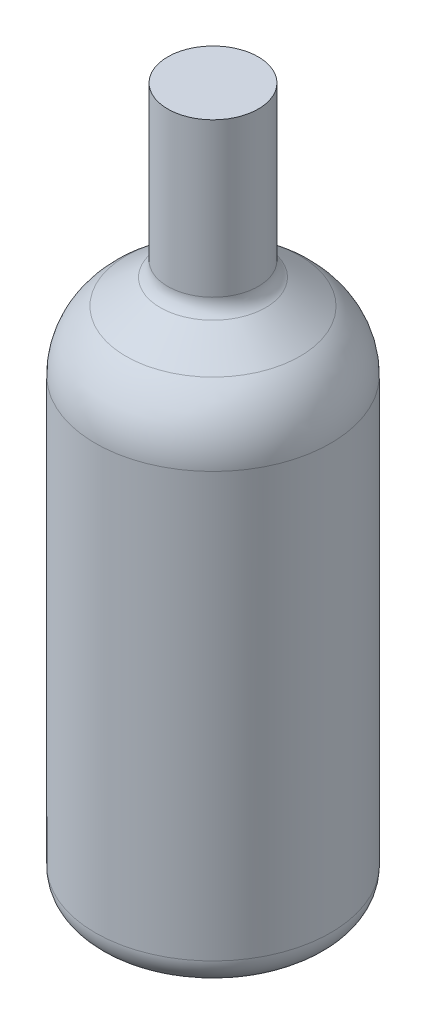
ISO-10303-21;
HEADER;
FILE_DESCRIPTION(('STEP AP214'),'2;1');
FILE_NAME('part.step','',(''),(''),'','','');
FILE_SCHEMA(('AUTOMOTIVE_DESIGN { 1 0 10303 214 1 1 1 1 }'));
ENDSEC;
DATA;
#1=APPLICATION_CONTEXT('core data for automotive mechanical design processes');
#2=APPLICATION_PROTOCOL_DEFINITION('international standard','automotive_design',2000,#1);
#3=PRODUCT_CONTEXT('',#1,'mechanical');
#4=PRODUCT('Part','Part','',(#3));
#5=PRODUCT_RELATED_PRODUCT_CATEGORY('part','',(#4));
#6=PRODUCT_DEFINITION_FORMATION('','',#4);
#7=PRODUCT_DEFINITION_CONTEXT('part definition',#1,'design');
#8=PRODUCT_DEFINITION('design','',#6,#7);
#9=PRODUCT_DEFINITION_SHAPE('','',#8);
#10=(LENGTH_UNIT() NAMED_UNIT(*) SI_UNIT(.MILLI.,.METRE.));
#11=(NAMED_UNIT(*) PLANE_ANGLE_UNIT() SI_UNIT($,.RADIAN.));
#12=(NAMED_UNIT(*) SI_UNIT($,.STERADIAN.) SOLID_ANGLE_UNIT());
#13=UNCERTAINTY_MEASURE_WITH_UNIT(LENGTH_MEASURE(1.E-05),#10,'distance_accuracy_value','');
#14=(GEOMETRIC_REPRESENTATION_CONTEXT(3) GLOBAL_UNCERTAINTY_ASSIGNED_CONTEXT((#13)) GLOBAL_UNIT_ASSIGNED_CONTEXT((#10,
#11,#12)) REPRESENTATION_CONTEXT('',''));
#15=CARTESIAN_POINT('',(0.,0.,0.));
#16=DIRECTION('',(0.,0.,1.));
#17=DIRECTION('',(1.,0.,0.));
#18=AXIS2_PLACEMENT_3D('',#15,#16,#17);
#19=CARTESIAN_POINT('',(0.,158.75,0.));
#20=DIRECTION('',(0.,-1.,0.));
#21=DIRECTION('',(0.,0.,-1.));
#22=AXIS2_PLACEMENT_3D('',#19,#20,#21);
#23=CYLINDRICAL_SURFACE('',#22,41.275);
#24=CARTESIAN_POINT('',(0.,9.99999999999998,0.));
#25=DIRECTION('',(0.,1.,0.));
#26=DIRECTION('',(0.,0.,1.));
#27=AXIS2_PLACEMENT_3D('',#24,#25,#26);
#28=CIRCLE('',#27,41.275);
#29=CARTESIAN_POINT('',(0.,9.99999999999998,-41.275));
#30=VERTEX_POINT('',#29);
#31=EDGE_CURVE('E45',#30,#30,#28,.T.);
#32=CARTESIAN_POINT('',(0.,158.75,0.));
#33=DIRECTION('',(0.,1.,0.));
#34=DIRECTION('',(0.,0.,1.));
#35=AXIS2_PLACEMENT_3D('',#32,#33,#34);
#36=CIRCLE('',#35,41.275);
#37=CARTESIAN_POINT('',(0.,158.75,-41.275));
#38=VERTEX_POINT('',#37);
#39=EDGE_CURVE('E50',#38,#38,#36,.T.);
#40=CARTESIAN_POINT('',(0.,9.99999999999998,-41.275));
#41=CARTESIAN_POINT('',(0.,11.5494791666666,-41.275));
#42=CARTESIAN_POINT('',(0.,13.0989583333333,-41.275));
#43=CARTESIAN_POINT('',(0.,16.1979166666666,-41.275));
#44=CARTESIAN_POINT('',(0.,17.7473958333333,-41.275));
#45=CARTESIAN_POINT('',(0.,20.8463541666667,-41.275));
#46=CARTESIAN_POINT('',(0.,22.3958333333333,-41.275));
#47=CARTESIAN_POINT('',(0.,25.4947916666666,-41.275));
#48=CARTESIAN_POINT('',(0.,27.0442708333333,-41.275));
#49=CARTESIAN_POINT('',(0.,30.1432291666666,-41.275));
#50=CARTESIAN_POINT('',(0.,31.6927083333333,-41.275));
#51=CARTESIAN_POINT('',(0.,34.7916666666667,-41.275));
#52=CARTESIAN_POINT('',(0.,36.3411458333333,-41.275));
#53=CARTESIAN_POINT('',(0.,39.4401041666666,-41.275));
#54=CARTESIAN_POINT('',(0.,40.9895833333333,-41.275));
#55=CARTESIAN_POINT('',(0.,44.0885416666666,-41.275));
#56=CARTESIAN_POINT('',(0.,45.6380208333333,-41.275));
#57=CARTESIAN_POINT('',(0.,48.7369791666666,-41.275));
#58=CARTESIAN_POINT('',(0.,50.2864583333333,-41.275));
#59=CARTESIAN_POINT('',(0.,53.3854166666666,-41.275));
#60=CARTESIAN_POINT('',(0.,54.9348958333333,-41.275));
#61=CARTESIAN_POINT('',(0.,58.0338541666666,-41.275));
#62=CARTESIAN_POINT('',(0.,59.5833333333333,-41.275));
#63=CARTESIAN_POINT('',(0.,62.6822916666666,-41.275));
#64=CARTESIAN_POINT('',(0.,64.2317708333333,-41.275));
#65=CARTESIAN_POINT('',(0.,67.3307291666666,-41.275));
#66=CARTESIAN_POINT('',(0.,68.8802083333333,-41.275));
#67=CARTESIAN_POINT('',(0.,71.9791666666666,-41.275));
#68=CARTESIAN_POINT('',(0.,73.5286458333333,-41.275));
#69=CARTESIAN_POINT('',(0.,76.6276041666666,-41.275));
#70=CARTESIAN_POINT('',(0.,78.1770833333333,-41.275));
#71=CARTESIAN_POINT('',(0.,81.2760416666666,-41.275));
#72=CARTESIAN_POINT('',(0.,82.8255208333333,-41.275));
#73=CARTESIAN_POINT('',(0.,85.9244791666667,-41.275));
#74=CARTESIAN_POINT('',(0.,87.4739583333333,-41.275));
#75=CARTESIAN_POINT('',(0.,90.5729166666666,-41.275));
#76=CARTESIAN_POINT('',(0.,92.1223958333333,-41.275));
#77=CARTESIAN_POINT('',(0.,95.2213541666666,-41.275));
#78=CARTESIAN_POINT('',(0.,96.7708333333333,-41.275));
#79=CARTESIAN_POINT('',(0.,99.8697916666666,-41.275));
#80=CARTESIAN_POINT('',(0.,101.419270833333,-41.275));
#81=CARTESIAN_POINT('',(0.,104.518229166667,-41.275));
#82=CARTESIAN_POINT('',(0.,106.067708333333,-41.275));
#83=CARTESIAN_POINT('',(0.,109.166666666667,-41.275));
#84=CARTESIAN_POINT('',(0.,110.716145833333,-41.275));
#85=CARTESIAN_POINT('',(0.,113.815104166667,-41.275));
#86=CARTESIAN_POINT('',(0.,115.364583333333,-41.275));
#87=CARTESIAN_POINT('',(0.,118.463541666667,-41.275));
#88=CARTESIAN_POINT('',(0.,120.013020833333,-41.275));
#89=CARTESIAN_POINT('',(0.,123.111979166667,-41.275));
#90=CARTESIAN_POINT('',(0.,124.661458333333,-41.275));
#91=CARTESIAN_POINT('',(0.,127.760416666667,-41.275));
#92=CARTESIAN_POINT('',(0.,129.309895833333,-41.275));
#93=CARTESIAN_POINT('',(0.,132.408854166667,-41.275));
#94=CARTESIAN_POINT('',(0.,133.958333333333,-41.275));
#95=CARTESIAN_POINT('',(0.,137.057291666667,-41.275));
#96=CARTESIAN_POINT('',(0.,138.606770833333,-41.275));
#97=CARTESIAN_POINT('',(0.,141.705729166667,-41.275));
#98=CARTESIAN_POINT('',(0.,143.255208333333,-41.275));
#99=CARTESIAN_POINT('',(0.,146.354166666667,-41.275));
#100=CARTESIAN_POINT('',(0.,147.903645833333,-41.275));
#101=CARTESIAN_POINT('',(0.,151.002604166667,-41.275));
#102=CARTESIAN_POINT('',(0.,152.552083333333,-41.275));
#103=CARTESIAN_POINT('',(0.,155.651041666667,-41.275));
#104=CARTESIAN_POINT('',(0.,157.200520833333,-41.275));
#105=CARTESIAN_POINT('',(0.,158.75,-41.275));
#106=B_SPLINE_CURVE_WITH_KNOTS('',3,(#40,#41,#42,#43,#44,#45,#46,#47,#48,#49,#50,#51,#52,#53,
#54,#55,#56,#57,#58,#59,#60,#61,#62,#63,#64,#65,#66,#67,#68,#69,#70,#71,#72,#73,#74,#75,#76,#77,
#78,#79,#80,#81,#82,#83,#84,#85,#86,#87,#88,#89,#90,#91,#92,#93,#94,#95,#96,#97,#98,#99,#100,
#101,#102,#103,#104,#105),.UNSPECIFIED.,.F.,.F.,(4,2,2,2,2,2,2,2,2,2,2,2,2,2,2,2,2,2,2,2,2,2,2,
2,2,2,2,2,2,2,2,2,4),(0.,4.64843749999999,9.29687500000001,13.9453125,18.59375,23.2421875,
27.890625,32.5390625,37.1875,41.8359375,46.484375,51.1328125,55.78125,60.4296875,65.078125,
69.7265625,74.375,79.0234375,83.671875,88.3203125,92.96875,97.6171875,102.265625,106.9140625,
111.5625,116.2109375,120.859375,125.5078125,130.15625,134.8046875,139.453125,144.1015625,
148.75),.UNSPECIFIED.);
#107=EDGE_CURVE('BSEAM37',#30,#38,#106,.T.);
#108=ORIENTED_EDGE('',*,*,#31,.T.);
#109=ORIENTED_EDGE('',*,*,#39,.F.);
#110=ORIENTED_EDGE('',*,*,#107,.T.);
#111=ORIENTED_EDGE('',*,*,#107,.F.);
#112=EDGE_LOOP('',(#108,#110,#109,#111));
#113=FACE_BOUND('',#112,.T.);
#114=ADVANCED_FACE('F37',(#113),#23,.T.);
#115=CARTESIAN_POINT('',(0.,0.,0.));
#116=DIRECTION('',(0.,1.,0.));
#117=DIRECTION('',(0.,0.,1.));
#118=AXIS2_PLACEMENT_3D('',#115,#116,#117);
#119=PLANE('',#118);
#120=CARTESIAN_POINT('',(0.,0.,0.));
#121=DIRECTION('',(0.,1.,0.));
#122=DIRECTION('',(0.,0.,1.));
#123=AXIS2_PLACEMENT_3D('',#120,#121,#122);
#124=CIRCLE('',#123,31.275);
#125=CARTESIAN_POINT('',(0.,0.,31.275));
#126=VERTEX_POINT('',#125);
#127=EDGE_CURVE('E10',#126,#126,#124,.F.);
#128=ORIENTED_EDGE('',*,*,#127,.T.);
#129=EDGE_LOOP('',(#128));
#130=FACE_BOUND('',#129,.T.);
#131=ADVANCED_FACE('F80',(#130),#119,.F.);
#132=CARTESIAN_POINT('',(0.,158.75,0.));
#133=DIRECTION('',(0.,1.,0.));
#134=DIRECTION('',(-1.,0.,0.));
#135=AXIS2_PLACEMENT_3D('',#132,#133,#134);
#136=DEGENERATE_TOROIDAL_SURFACE('',#135,15.2077325511096,26.0672674488904,.T.);
#137=CARTESIAN_POINT('',(0.,179.829366121803,0.));
#138=DIRECTION('',(0.,1.,0.));
#139=DIRECTION('',(-1.,0.,0.));
#140=AXIS2_PLACEMENT_3D('',#137,#138,#139);
#141=CIRCLE('',#140,30.5427498694875);
#142=CARTESIAN_POINT('',(-30.5427498694875,179.829366121803,0.));
#143=VERTEX_POINT('',#142);
#144=EDGE_CURVE('E69',#143,#143,#141,.T.);
#145=ORIENTED_EDGE('',*,*,#144,.F.);
#146=EDGE_LOOP('',(#145));
#147=FACE_BOUND('',#146,.T.);
#148=ORIENTED_EDGE('',*,*,#39,.T.);
#149=EDGE_LOOP('',(#148));
#150=FACE_BOUND('',#149,.T.);
#151=ADVANCED_FACE('F76',(#147,#150),#136,.T.);
#152=CARTESIAN_POINT('',(15.875,247.65,0.));
#153=DIRECTION('',(0.,-1.,0.));
#154=DIRECTION('',(1.,0.,0.));
#155=AXIS2_PLACEMENT_3D('',#152,#153,#154);
#156=PLANE('',#155);
#157=CARTESIAN_POINT('',(0.,247.65,0.));
#158=DIRECTION('',(0.,1.,0.));
#159=DIRECTION('',(-1.,0.,0.));
#160=AXIS2_PLACEMENT_3D('',#157,#158,#159);
#161=CIRCLE('',#160,15.875);
#162=CARTESIAN_POINT('',(-15.875,247.65,0.));
#163=VERTEX_POINT('',#162);
#164=EDGE_CURVE('E55',#163,#163,#161,.T.);
#165=ORIENTED_EDGE('',*,*,#164,.T.);
#166=EDGE_LOOP('',(#165));
#167=FACE_BOUND('',#166,.T.);
#168=ADVANCED_FACE('F79',(#167),#156,.F.);
#169=CARTESIAN_POINT('',(0.,247.65,0.));
#170=DIRECTION('',(0.,1.,0.));
#171=DIRECTION('',(-1.,0.,0.));
#172=AXIS2_PLACEMENT_3D('',#169,#170,#171);
#173=CYLINDRICAL_SURFACE('',#172,15.875);
#174=ORIENTED_EDGE('',*,*,#164,.F.);
#175=EDGE_LOOP('',(#174));
#176=FACE_BOUND('',#175,.T.);
#177=CARTESIAN_POINT('',(0.,193.733009376798,0.));
#178=DIRECTION('',(0.,1.,0.));
#179=DIRECTION('',(-1.,0.,0.));
#180=AXIS2_PLACEMENT_3D('',#177,#178,#179);
#181=CIRCLE('',#180,15.875);
#182=CARTESIAN_POINT('',(-15.875,193.733009376798,0.));
#183=VERTEX_POINT('',#182);
#184=EDGE_CURVE('E61',#183,#183,#181,.T.);
#185=ORIENTED_EDGE('',*,*,#184,.T.);
#186=EDGE_LOOP('',(#185));
#187=FACE_BOUND('',#186,.T.);
#188=ADVANCED_FACE('F92',(#176,#187),#173,.T.);
#189=CARTESIAN_POINT('',(0.,193.733009376798,0.));
#190=DIRECTION('',(0.,1.,0.));
#191=DIRECTION('',(-1.,0.,0.));
#192=AXIS2_PLACEMENT_3D('',#189,#190,#191);
#193=TOROIDAL_SURFACE('',#192,22.225,6.35000000000001);
#194=ORIENTED_EDGE('',*,*,#184,.F.);
#195=EDGE_LOOP('',(#194));
#196=FACE_BOUND('',#195,.T.);
#197=CARTESIAN_POINT('',(0.,188.598064751862,0.));
#198=DIRECTION('',(0.,1.,0.));
#199=DIRECTION('',(-1.,0.,0.));
#200=AXIS2_PLACEMENT_3D('',#197,#198,#199);
#201=CIRCLE('',#200,18.489381751458);
#202=CARTESIAN_POINT('',(-18.489381751458,188.598064751862,0.));
#203=VERTEX_POINT('',#202);
#204=EDGE_CURVE('E65',#203,#203,#201,.T.);
#205=ORIENTED_EDGE('',*,*,#204,.T.);
#206=EDGE_LOOP('',(#205));
#207=FACE_BOUND('',#206,.T.);
#208=ADVANCED_FACE('F96',(#196,#207),#193,.F.);
#209=CARTESIAN_POINT('',(0.,179.829366121803,0.));
#210=DIRECTION('',(0.,-1.,0.));
#211=DIRECTION('',(1.,0.,0.));
#212=AXIS2_PLACEMENT_3D('',#209,#210,#211);
#213=CONICAL_SURFACE('',#212,30.5427498694875,0.941858280180349);
#214=ORIENTED_EDGE('',*,*,#204,.F.);
#215=EDGE_LOOP('',(#214));
#216=FACE_BOUND('',#215,.T.);
#217=ORIENTED_EDGE('',*,*,#144,.T.);
#218=EDGE_LOOP('',(#217));
#219=FACE_BOUND('',#218,.T.);
#220=ADVANCED_FACE('F74',(#216,#219),#213,.T.);
#221=CARTESIAN_POINT('',(0.,10.,0.));
#222=DIRECTION('',(0.,1.,0.));
#223=DIRECTION('',(0.,0.,1.));
#224=AXIS2_PLACEMENT_3D('',#221,#222,#223);
#225=TOROIDAL_SURFACE('',#224,31.275,10.);
#226=ORIENTED_EDGE('',*,*,#127,.F.);
#227=EDGE_LOOP('',(#226));
#228=FACE_BOUND('',#227,.T.);
#229=ORIENTED_EDGE('',*,*,#31,.F.);
#230=EDGE_LOOP('',(#229));
#231=FACE_BOUND('',#230,.T.);
#232=ADVANCED_FACE('F39',(#228,#231),#225,.T.);
#233=CLOSED_SHELL('',(#114,#131,#151,#168,#188,#208,#220,#232));
#234=MANIFOLD_SOLID_BREP('B2',#233);
#235=ADVANCED_BREP_SHAPE_REPRESENTATION('',(#18,#234),#14);
#236=SHAPE_DEFINITION_REPRESENTATION(#9,#235);
ENDSEC;
END-ISO-10303-21;
